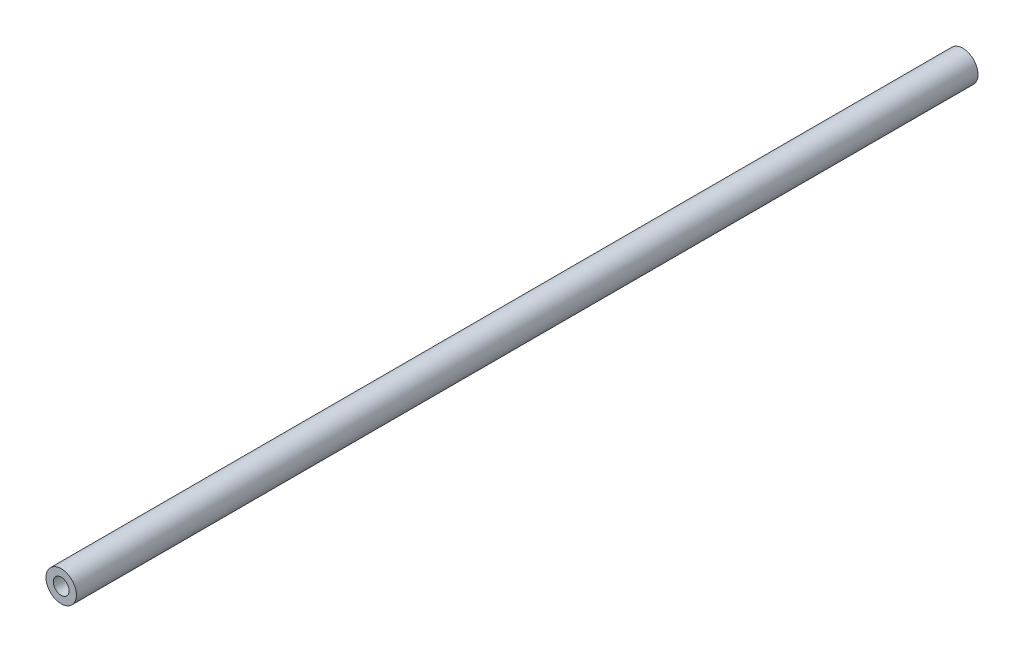
ISO-10303-21;
HEADER;
FILE_DESCRIPTION(('STEP AP214'),'2;1');
FILE_NAME('part.step','',(''),(''),'','','');
FILE_SCHEMA(('AUTOMOTIVE_DESIGN { 1 0 10303 214 1 1 1 1 }'));
ENDSEC;
DATA;
#1=APPLICATION_CONTEXT('core data for automotive mechanical design processes');
#2=APPLICATION_PROTOCOL_DEFINITION('international standard','automotive_design',2000,#1);
#3=PRODUCT_CONTEXT('',#1,'mechanical');
#4=PRODUCT('Part','Part','',(#3));
#5=PRODUCT_RELATED_PRODUCT_CATEGORY('part','',(#4));
#6=PRODUCT_DEFINITION_FORMATION('','',#4);
#7=PRODUCT_DEFINITION_CONTEXT('part definition',#1,'design');
#8=PRODUCT_DEFINITION('design','',#6,#7);
#9=PRODUCT_DEFINITION_SHAPE('','',#8);
#10=(LENGTH_UNIT() NAMED_UNIT(*) SI_UNIT(.MILLI.,.METRE.));
#11=(NAMED_UNIT(*) PLANE_ANGLE_UNIT() SI_UNIT($,.RADIAN.));
#12=(NAMED_UNIT(*) SI_UNIT($,.STERADIAN.) SOLID_ANGLE_UNIT());
#13=UNCERTAINTY_MEASURE_WITH_UNIT(LENGTH_MEASURE(1.E-05),#10,'distance_accuracy_value','');
#14=(GEOMETRIC_REPRESENTATION_CONTEXT(3) GLOBAL_UNCERTAINTY_ASSIGNED_CONTEXT((#13)) GLOBAL_UNIT_ASSIGNED_CONTEXT((#10,
#11,#12)) REPRESENTATION_CONTEXT('',''));
#15=CARTESIAN_POINT('',(0.,0.,0.));
#16=DIRECTION('',(0.,0.,1.));
#17=DIRECTION('',(1.,0.,0.));
#18=AXIS2_PLACEMENT_3D('',#15,#16,#17);
#19=CARTESIAN_POINT('',(0.,0.,10.16));
#20=DIRECTION('',(0.,0.,1.));
#21=DIRECTION('',(1.,0.,0.));
#22=AXIS2_PLACEMENT_3D('',#19,#20,#21);
#23=PLANE('',#22);
#24=CARTESIAN_POINT('',(0.,0.,10.16));
#25=DIRECTION('',(0.,0.,1.));
#26=DIRECTION('',(1.,0.,0.));
#27=AXIS2_PLACEMENT_3D('',#24,#25,#26);
#28=CIRCLE('',#27,0.17145);
#29=CARTESIAN_POINT('',(0.17145,0.,10.16));
#30=VERTEX_POINT('',#29);
#31=EDGE_CURVE('E10',#30,#30,#28,.T.);
#32=ORIENTED_EDGE('',*,*,#31,.T.);
#33=EDGE_LOOP('',(#32));
#34=FACE_BOUND('',#33,.T.);
#35=CARTESIAN_POINT('',(0.,0.,10.16));
#36=DIRECTION('',(0.,0.,1.));
#37=DIRECTION('',(1.,0.,0.));
#38=AXIS2_PLACEMENT_3D('',#35,#36,#37);
#39=CIRCLE('',#38,0.0889);
#40=CARTESIAN_POINT('',(0.0889,0.,10.16));
#41=VERTEX_POINT('',#40);
#42=EDGE_CURVE('E41',#41,#41,#39,.T.);
#43=ORIENTED_EDGE('',*,*,#42,.F.);
#44=EDGE_LOOP('',(#43));
#45=FACE_BOUND('',#44,.T.);
#46=ADVANCED_FACE('F30',(#34,#45),#23,.T.);
#47=CARTESIAN_POINT('',(0.,0.,0.));
#48=DIRECTION('',(0.,0.,1.));
#49=DIRECTION('',(1.,0.,0.));
#50=AXIS2_PLACEMENT_3D('',#47,#48,#49);
#51=PLANE('',#50);
#52=CARTESIAN_POINT('',(0.,0.,0.));
#53=DIRECTION('',(0.,0.,1.));
#54=DIRECTION('',(1.,0.,0.));
#55=AXIS2_PLACEMENT_3D('',#52,#53,#54);
#56=CIRCLE('',#55,0.17145);
#57=CARTESIAN_POINT('',(0.17145,0.,0.));
#58=VERTEX_POINT('',#57);
#59=EDGE_CURVE('E34',#58,#58,#56,.T.);
#60=ORIENTED_EDGE('',*,*,#59,.F.);
#61=EDGE_LOOP('',(#60));
#62=FACE_BOUND('',#61,.T.);
#63=CARTESIAN_POINT('',(0.,0.,0.));
#64=DIRECTION('',(0.,0.,1.));
#65=DIRECTION('',(1.,0.,0.));
#66=AXIS2_PLACEMENT_3D('',#63,#64,#65);
#67=CIRCLE('',#66,0.0889);
#68=CARTESIAN_POINT('',(0.0889,0.,0.));
#69=VERTEX_POINT('',#68);
#70=EDGE_CURVE('E43',#69,#69,#67,.T.);
#71=ORIENTED_EDGE('',*,*,#70,.T.);
#72=EDGE_LOOP('',(#71));
#73=FACE_BOUND('',#72,.T.);
#74=ADVANCED_FACE('F53',(#62,#73),#51,.F.);
#75=CARTESIAN_POINT('',(0.,0.,10.16));
#76=DIRECTION('',(0.,0.,-1.));
#77=DIRECTION('',(-1.,0.,0.));
#78=AXIS2_PLACEMENT_3D('',#75,#76,#77);
#79=CYLINDRICAL_SURFACE('',#78,0.17145);
#80=ORIENTED_EDGE('',*,*,#31,.F.);
#81=EDGE_LOOP('',(#80));
#82=FACE_BOUND('',#81,.T.);
#83=ORIENTED_EDGE('',*,*,#59,.T.);
#84=EDGE_LOOP('',(#83));
#85=FACE_BOUND('',#84,.T.);
#86=ADVANCED_FACE('F32',(#82,#85),#79,.T.);
#87=CARTESIAN_POINT('',(0.,0.,10.16));
#88=DIRECTION('',(0.,0.,-1.));
#89=DIRECTION('',(-1.,0.,0.));
#90=AXIS2_PLACEMENT_3D('',#87,#88,#89);
#91=CYLINDRICAL_SURFACE('',#90,0.0889);
#92=ORIENTED_EDGE('',*,*,#42,.T.);
#93=EDGE_LOOP('',(#92));
#94=FACE_BOUND('',#93,.T.);
#95=ORIENTED_EDGE('',*,*,#70,.F.);
#96=EDGE_LOOP('',(#95));
#97=FACE_BOUND('',#96,.T.);
#98=ADVANCED_FACE('F49',(#94,#97),#91,.F.);
#99=CLOSED_SHELL('',(#46,#74,#86,#98));
#100=MANIFOLD_SOLID_BREP('B2',#99);
#101=ADVANCED_BREP_SHAPE_REPRESENTATION('',(#18,#100),#14);
#102=SHAPE_DEFINITION_REPRESENTATION(#9,#101);
ENDSEC;
END-ISO-10303-21;
